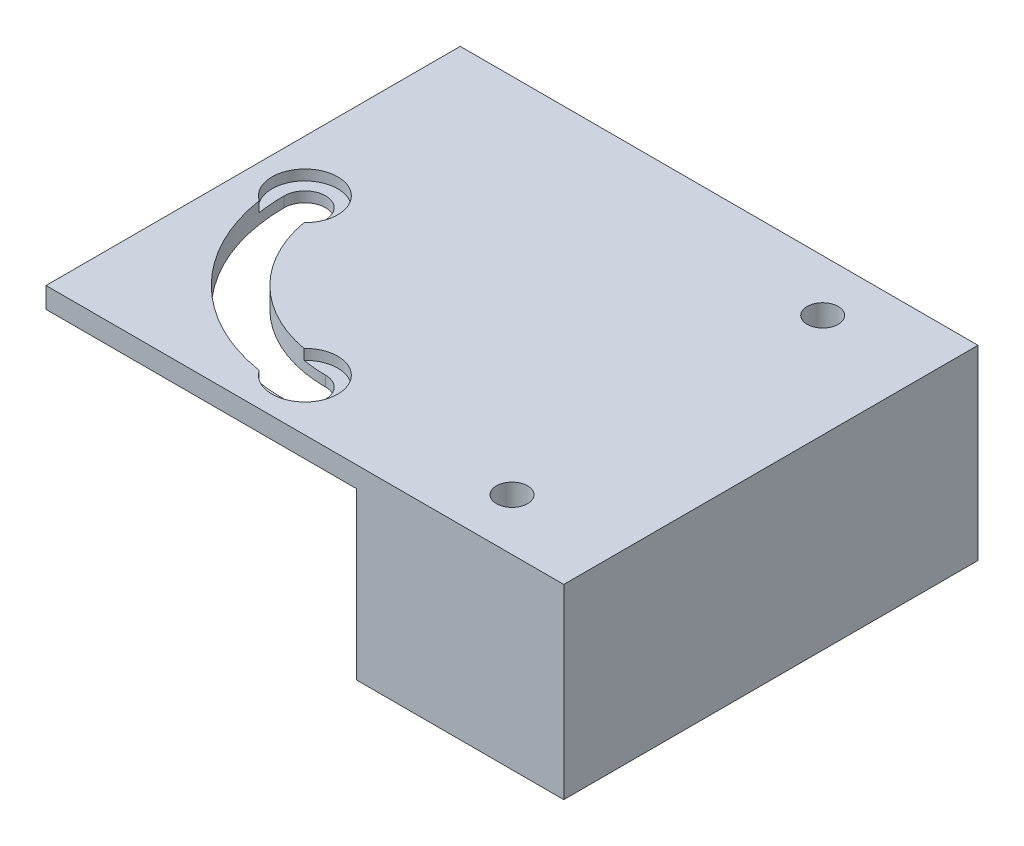
ISO-10303-21;
HEADER;
FILE_DESCRIPTION(('STEP AP214'),'2;1');
FILE_NAME('part.step','',(''),(''),'','','');
FILE_SCHEMA(('AUTOMOTIVE_DESIGN { 1 0 10303 214 1 1 1 1 }'));
ENDSEC;
DATA;
#1=APPLICATION_CONTEXT('core data for automotive mechanical design processes');
#2=APPLICATION_PROTOCOL_DEFINITION('international standard','automotive_design',2000,#1);
#3=PRODUCT_CONTEXT('',#1,'mechanical');
#4=PRODUCT('Part','Part','',(#3));
#5=PRODUCT_RELATED_PRODUCT_CATEGORY('part','',(#4));
#6=PRODUCT_DEFINITION_FORMATION('','',#4);
#7=PRODUCT_DEFINITION_CONTEXT('part definition',#1,'design');
#8=PRODUCT_DEFINITION('design','',#6,#7);
#9=PRODUCT_DEFINITION_SHAPE('','',#8);
#10=(LENGTH_UNIT() NAMED_UNIT(*) SI_UNIT(.MILLI.,.METRE.));
#11=(NAMED_UNIT(*) PLANE_ANGLE_UNIT() SI_UNIT($,.RADIAN.));
#12=(NAMED_UNIT(*) SI_UNIT($,.STERADIAN.) SOLID_ANGLE_UNIT());
#13=UNCERTAINTY_MEASURE_WITH_UNIT(LENGTH_MEASURE(1.E-05),#10,'distance_accuracy_value','');
#14=(GEOMETRIC_REPRESENTATION_CONTEXT(3) GLOBAL_UNCERTAINTY_ASSIGNED_CONTEXT((#13)) GLOBAL_UNIT_ASSIGNED_CONTEXT((#10,
#11,#12)) REPRESENTATION_CONTEXT('',''));
#15=CARTESIAN_POINT('',(0.,0.,0.));
#16=DIRECTION('',(0.,0.,1.));
#17=DIRECTION('',(1.,0.,0.));
#18=AXIS2_PLACEMENT_3D('',#15,#16,#17);
#19=CARTESIAN_POINT('',(-25.,-12.,0.));
#20=DIRECTION('',(0.,1.,0.));
#21=DIRECTION('',(0.,0.,1.));
#22=AXIS2_PLACEMENT_3D('',#19,#20,#21);
#23=CYLINDRICAL_SURFACE('',#22,2.);
#24=CARTESIAN_POINT('',(-25.,1.,0.));
#25=DIRECTION('',(0.,1.,0.));
#26=DIRECTION('',(0.,0.,1.));
#27=AXIS2_PLACEMENT_3D('',#24,#25,#26);
#28=CIRCLE('',#27,2.);
#29=CARTESIAN_POINT('',(-27.,1.,0.));
#30=VERTEX_POINT('',#29);
#31=CARTESIAN_POINT('',(-23.,1.,0.));
#32=VERTEX_POINT('',#31);
#33=EDGE_CURVE('E229',#30,#32,#28,.F.);
#34=ORIENTED_EDGE('',*,*,#33,.F.);
#35=DIRECTION('',(0.,1.,0.));
#36=VECTOR('',#35,1.);
#37=CARTESIAN_POINT('',(-27.,-12.,0.));
#38=LINE('',#37,#36);
#39=CARTESIAN_POINT('',(-27.,0.,0.));
#40=VERTEX_POINT('',#39);
#41=EDGE_CURVE('E159',#40,#30,#38,.T.);
#42=ORIENTED_EDGE('',*,*,#41,.F.);
#43=CARTESIAN_POINT('',(-25.,0.,0.));
#44=DIRECTION('',(0.,1.,0.));
#45=DIRECTION('',(0.,0.,1.));
#46=AXIS2_PLACEMENT_3D('',#43,#44,#45);
#47=CIRCLE('',#46,2.);
#48=CARTESIAN_POINT('',(-23.,0.,0.));
#49=VERTEX_POINT('',#48);
#50=EDGE_CURVE('E180',#49,#40,#47,.T.);
#51=ORIENTED_EDGE('',*,*,#50,.F.);
#52=DIRECTION('',(0.,1.,0.));
#53=VECTOR('',#52,1.);
#54=CARTESIAN_POINT('',(-23.,-12.,0.));
#55=LINE('',#54,#53);
#56=EDGE_CURVE('E166',#49,#32,#55,.T.);
#57=ORIENTED_EDGE('',*,*,#56,.T.);
#58=EDGE_LOOP('',(#34,#42,#51,#57));
#59=FACE_BOUND('',#58,.T.);
#60=ADVANCED_FACE('F32',(#59),#23,.F.);
#61=CARTESIAN_POINT('',(-10.,-12.,15.));
#62=DIRECTION('',(0.,1.,0.));
#63=DIRECTION('',(0.,0.,1.));
#64=AXIS2_PLACEMENT_3D('',#61,#62,#63);
#65=CYLINDRICAL_SURFACE('',#64,2.);
#66=CARTESIAN_POINT('',(-10.,1.,15.));
#67=DIRECTION('',(0.,1.,0.));
#68=DIRECTION('',(0.,0.,1.));
#69=AXIS2_PLACEMENT_3D('',#66,#67,#68);
#70=CIRCLE('',#69,2.);
#71=CARTESIAN_POINT('',(-10.,1.,13.));
#72=VERTEX_POINT('',#71);
#73=CARTESIAN_POINT('',(-10.,1.,17.));
#74=VERTEX_POINT('',#73);
#75=EDGE_CURVE('E239',#72,#74,#70,.F.);
#76=ORIENTED_EDGE('',*,*,#75,.F.);
#77=DIRECTION('',(0.,1.,0.));
#78=VECTOR('',#77,1.);
#79=CARTESIAN_POINT('',(-10.,-12.,13.));
#80=LINE('',#79,#78);
#81=CARTESIAN_POINT('',(-10.,0.,13.));
#82=VERTEX_POINT('',#81);
#83=EDGE_CURVE('E218',#82,#72,#80,.T.);
#84=ORIENTED_EDGE('',*,*,#83,.F.);
#85=CARTESIAN_POINT('',(-10.,0.,15.));
#86=DIRECTION('',(0.,1.,0.));
#87=DIRECTION('',(0.,0.,1.));
#88=AXIS2_PLACEMENT_3D('',#85,#86,#87);
#89=CIRCLE('',#88,2.);
#90=CARTESIAN_POINT('',(-10.,0.,17.));
#91=VERTEX_POINT('',#90);
#92=EDGE_CURVE('E174',#91,#82,#89,.T.);
#93=ORIENTED_EDGE('',*,*,#92,.F.);
#94=DIRECTION('',(0.,1.,0.));
#95=VECTOR('',#94,1.);
#96=CARTESIAN_POINT('',(-10.,-12.,17.));
#97=LINE('',#96,#95);
#98=EDGE_CURVE('E220',#91,#74,#97,.T.);
#99=ORIENTED_EDGE('',*,*,#98,.T.);
#100=EDGE_LOOP('',(#76,#84,#93,#99));
#101=FACE_BOUND('',#100,.T.);
#102=ADVANCED_FACE('F238',(#101),#65,.F.);
#103=CARTESIAN_POINT('',(0.,0.,0.));
#104=DIRECTION('',(0.,1.,0.));
#105=DIRECTION('',(0.,0.,1.));
#106=AXIS2_PLACEMENT_3D('',#103,#104,#105);
#107=PLANE('',#106);
#108=CARTESIAN_POINT('',(-10.,0.,0.));
#109=DIRECTION('',(0.,1.,0.));
#110=DIRECTION('',(0.,0.,1.));
#111=AXIS2_PLACEMENT_3D('',#108,#109,#110);
#112=CIRCLE('',#111,13.);
#113=EDGE_CURVE('E177',#82,#49,#112,.F.);
#114=ORIENTED_EDGE('',*,*,#113,.T.);
#115=ORIENTED_EDGE('',*,*,#50,.T.);
#116=CARTESIAN_POINT('',(-10.,0.,0.));
#117=DIRECTION('',(0.,1.,0.));
#118=DIRECTION('',(0.,0.,1.));
#119=AXIS2_PLACEMENT_3D('',#116,#117,#118);
#120=CIRCLE('',#119,17.);
#121=EDGE_CURVE('E171',#40,#91,#120,.T.);
#122=ORIENTED_EDGE('',*,*,#121,.T.);
#123=ORIENTED_EDGE('',*,*,#92,.T.);
#124=EDGE_LOOP('',(#114,#115,#122,#123));
#125=FACE_BOUND('',#124,.T.);
#126=CARTESIAN_POINT('',(-10.,0.,0.));
#127=DIRECTION('',(0.,1.,0.));
#128=DIRECTION('',(0.,0.,1.));
#129=AXIS2_PLACEMENT_3D('',#126,#127,#128);
#130=CIRCLE('',#129,3.5);
#131=CARTESIAN_POINT('',(-10.,0.,3.50000000000001));
#132=VERTEX_POINT('',#131);
#133=EDGE_CURVE('E183',#132,#132,#130,.F.);
#134=ORIENTED_EDGE('',*,*,#133,.F.);
#135=EDGE_LOOP('',(#134));
#136=FACE_BOUND('',#135,.T.);
#137=DIRECTION('',(0.,0.,-1.));
#138=VECTOR('',#137,1.);
#139=CARTESIAN_POINT('',(0.,0.,20.));
#140=LINE('',#139,#138);
#141=CARTESIAN_POINT('',(0.,0.,20.));
#142=VERTEX_POINT('',#141);
#143=CARTESIAN_POINT('',(0.,0.,-20.));
#144=VERTEX_POINT('',#143);
#145=EDGE_CURVE('E258',#142,#144,#140,.T.);
#146=ORIENTED_EDGE('',*,*,#145,.F.);
#147=DIRECTION('',(1.,0.,0.));
#148=VECTOR('',#147,1.);
#149=CARTESIAN_POINT('',(-30.,0.,20.));
#150=LINE('',#149,#148);
#151=CARTESIAN_POINT('',(-30.,0.,20.));
#152=VERTEX_POINT('',#151);
#153=EDGE_CURVE('E152',#152,#142,#150,.T.);
#154=ORIENTED_EDGE('',*,*,#153,.F.);
#155=DIRECTION('',(0.,0.,1.));
#156=VECTOR('',#155,1.);
#157=CARTESIAN_POINT('',(-30.,0.,-20.));
#158=LINE('',#157,#156);
#159=CARTESIAN_POINT('',(-30.,0.,-20.));
#160=VERTEX_POINT('',#159);
#161=EDGE_CURVE('E156',#160,#152,#158,.T.);
#162=ORIENTED_EDGE('',*,*,#161,.F.);
#163=DIRECTION('',(-1.,0.,0.));
#164=VECTOR('',#163,1.);
#165=CARTESIAN_POINT('',(-30.,0.,-20.));
#166=LINE('',#165,#164);
#167=EDGE_CURVE('E164',#144,#160,#166,.T.);
#168=ORIENTED_EDGE('',*,*,#167,.F.);
#169=EDGE_LOOP('',(#146,#154,#162,#168));
#170=FACE_BOUND('',#169,.T.);
#171=ADVANCED_FACE('F231',(#125,#136,#170),#107,.F.);
#172=CARTESIAN_POINT('',(-30.,2.,-20.));
#173=DIRECTION('',(0.,0.,1.));
#174=DIRECTION('',(1.,0.,0.));
#175=AXIS2_PLACEMENT_3D('',#172,#173,#174);
#176=PLANE('',#175);
#177=DIRECTION('',(-1.,0.,0.));
#178=VECTOR('',#177,1.);
#179=CARTESIAN_POINT('',(-30.,2.,-20.));
#180=LINE('',#179,#178);
#181=CARTESIAN_POINT('',(20.,2.,-20.));
#182=VERTEX_POINT('',#181);
#183=CARTESIAN_POINT('',(-30.,2.,-20.));
#184=VERTEX_POINT('',#183);
#185=EDGE_CURVE('E142',#182,#184,#180,.T.);
#186=ORIENTED_EDGE('',*,*,#185,.F.);
#187=DIRECTION('',(0.,1.,0.));
#188=VECTOR('',#187,1.);
#189=CARTESIAN_POINT('',(20.,-18.,-20.));
#190=LINE('',#189,#188);
#191=CARTESIAN_POINT('',(20.,-16.,-20.));
#192=VERTEX_POINT('',#191);
#193=EDGE_CURVE('E130',#192,#182,#190,.T.);
#194=ORIENTED_EDGE('',*,*,#193,.F.);
#195=DIRECTION('',(1.,0.,0.));
#196=VECTOR('',#195,1.);
#197=CARTESIAN_POINT('',(0.,-16.,-20.));
#198=LINE('',#197,#196);
#199=CARTESIAN_POINT('',(0.,-16.,-20.));
#200=VERTEX_POINT('',#199);
#201=EDGE_CURVE('E262',#200,#192,#198,.T.);
#202=ORIENTED_EDGE('',*,*,#201,.F.);
#203=DIRECTION('',(0.,1.,0.));
#204=VECTOR('',#203,1.);
#205=CARTESIAN_POINT('',(0.,-16.,-20.));
#206=LINE('',#205,#204);
#207=EDGE_CURVE('E212',#200,#144,#206,.T.);
#208=ORIENTED_EDGE('',*,*,#207,.T.);
#209=ORIENTED_EDGE('',*,*,#167,.T.);
#210=DIRECTION('',(0.,-1.,0.));
#211=VECTOR('',#210,1.);
#212=CARTESIAN_POINT('',(-30.,2.,-20.));
#213=LINE('',#212,#211);
#214=EDGE_CURVE('E149',#184,#160,#213,.T.);
#215=ORIENTED_EDGE('',*,*,#214,.F.);
#216=EDGE_LOOP('',(#186,#194,#202,#208,#209,#215));
#217=FACE_BOUND('',#216,.T.);
#218=ADVANCED_FACE('F34',(#217),#176,.F.);
#219=CARTESIAN_POINT('',(-30.,2.,-20.));
#220=DIRECTION('',(1.,0.,0.));
#221=DIRECTION('',(0.,0.,-1.));
#222=AXIS2_PLACEMENT_3D('',#219,#220,#221);
#223=PLANE('',#222);
#224=ORIENTED_EDGE('',*,*,#161,.T.);
#225=DIRECTION('',(0.,-1.,0.));
#226=VECTOR('',#225,1.);
#227=CARTESIAN_POINT('',(-30.,2.,20.));
#228=LINE('',#227,#226);
#229=CARTESIAN_POINT('',(-30.,2.,20.));
#230=VERTEX_POINT('',#229);
#231=EDGE_CURVE('E163',#230,#152,#228,.T.);
#232=ORIENTED_EDGE('',*,*,#231,.F.);
#233=DIRECTION('',(0.,0.,1.));
#234=VECTOR('',#233,1.);
#235=CARTESIAN_POINT('',(-30.,2.,-20.));
#236=LINE('',#235,#234);
#237=EDGE_CURVE('E151',#184,#230,#236,.T.);
#238=ORIENTED_EDGE('',*,*,#237,.F.);
#239=ORIENTED_EDGE('',*,*,#214,.T.);
#240=EDGE_LOOP('',(#224,#232,#238,#239));
#241=FACE_BOUND('',#240,.T.);
#242=ADVANCED_FACE('F281',(#241),#223,.F.);
#243=CARTESIAN_POINT('',(-30.,2.,20.));
#244=DIRECTION('',(0.,0.,-1.));
#245=DIRECTION('',(-1.,0.,0.));
#246=AXIS2_PLACEMENT_3D('',#243,#244,#245);
#247=PLANE('',#246);
#248=DIRECTION('',(-1.,0.,0.));
#249=VECTOR('',#248,1.);
#250=CARTESIAN_POINT('',(0.,-16.,20.));
#251=LINE('',#250,#249);
#252=CARTESIAN_POINT('',(20.,-16.,20.));
#253=VERTEX_POINT('',#252);
#254=CARTESIAN_POINT('',(0.,-16.,20.));
#255=VERTEX_POINT('',#254);
#256=EDGE_CURVE('E264',#253,#255,#251,.T.);
#257=ORIENTED_EDGE('',*,*,#256,.F.);
#258=DIRECTION('',(0.,1.,0.));
#259=VECTOR('',#258,1.);
#260=CARTESIAN_POINT('',(20.,-18.,20.));
#261=LINE('',#260,#259);
#262=CARTESIAN_POINT('',(20.,2.,20.));
#263=VERTEX_POINT('',#262);
#264=EDGE_CURVE('E46',#253,#263,#261,.T.);
#265=ORIENTED_EDGE('',*,*,#264,.T.);
#266=DIRECTION('',(1.,0.,0.));
#267=VECTOR('',#266,1.);
#268=CARTESIAN_POINT('',(-30.,2.,20.));
#269=LINE('',#268,#267);
#270=EDGE_CURVE('E145',#230,#263,#269,.T.);
#271=ORIENTED_EDGE('',*,*,#270,.F.);
#272=ORIENTED_EDGE('',*,*,#231,.T.);
#273=ORIENTED_EDGE('',*,*,#153,.T.);
#274=DIRECTION('',(0.,1.,0.));
#275=VECTOR('',#274,1.);
#276=CARTESIAN_POINT('',(0.,-16.,20.));
#277=LINE('',#276,#275);
#278=EDGE_CURVE('E266',#255,#142,#277,.T.);
#279=ORIENTED_EDGE('',*,*,#278,.F.);
#280=EDGE_LOOP('',(#257,#265,#271,#272,#273,#279));
#281=FACE_BOUND('',#280,.T.);
#282=ADVANCED_FACE('F284',(#281),#247,.F.);
#283=CARTESIAN_POINT('',(0.,2.,0.));
#284=DIRECTION('',(0.,1.,0.));
#285=DIRECTION('',(0.,0.,1.));
#286=AXIS2_PLACEMENT_3D('',#283,#284,#285);
#287=PLANE('',#286);
#288=CARTESIAN_POINT('',(10.,2.,-15.));
#289=DIRECTION('',(0.,1.,0.));
#290=DIRECTION('',(0.,0.,1.));
#291=AXIS2_PLACEMENT_3D('',#288,#289,#290);
#292=CIRCLE('',#291,1.49999999999999);
#293=CARTESIAN_POINT('',(10.,2.,-13.5));
#294=VERTEX_POINT('',#293);
#295=EDGE_CURVE('E425',#294,#294,#292,.T.);
#296=ORIENTED_EDGE('',*,*,#295,.F.);
#297=EDGE_LOOP('',(#296));
#298=FACE_BOUND('',#297,.T.);
#299=CARTESIAN_POINT('',(10.,2.,15.));
#300=DIRECTION('',(0.,1.,0.));
#301=DIRECTION('',(0.,0.,1.));
#302=AXIS2_PLACEMENT_3D('',#299,#300,#301);
#303=CIRCLE('',#302,1.49999999999999);
#304=CARTESIAN_POINT('',(10.,2.,16.5));
#305=VERTEX_POINT('',#304);
#306=EDGE_CURVE('E427',#305,#305,#303,.T.);
#307=ORIENTED_EDGE('',*,*,#306,.F.);
#308=EDGE_LOOP('',(#307));
#309=FACE_BOUND('',#308,.T.);
#310=DIRECTION('',(0.,0.,1.));
#311=VECTOR('',#310,1.);
#312=CARTESIAN_POINT('',(20.,2.,-20.));
#313=LINE('',#312,#311);
#314=EDGE_CURVE('E133',#182,#263,#313,.T.);
#315=ORIENTED_EDGE('',*,*,#314,.F.);
#316=ORIENTED_EDGE('',*,*,#185,.T.);
#317=ORIENTED_EDGE('',*,*,#237,.T.);
#318=ORIENTED_EDGE('',*,*,#270,.T.);
#319=EDGE_LOOP('',(#315,#316,#317,#318));
#320=FACE_BOUND('',#319,.T.);
#321=CARTESIAN_POINT('',(-25.,2.,0.));
#322=DIRECTION('',(0.,1.,0.));
#323=DIRECTION('',(0.,0.,1.));
#324=AXIS2_PLACEMENT_3D('',#321,#322,#323);
#325=CIRCLE('',#324,3.175);
#326=CARTESIAN_POINT('',(-22.7973125,2.,2.28665536916777));
#327=VERTEX_POINT('',#326);
#328=CARTESIAN_POINT('',(-26.7973125,2.,2.61730639729929));
#329=VERTEX_POINT('',#328);
#330=EDGE_CURVE('E204',#327,#329,#325,.T.);
#331=ORIENTED_EDGE('',*,*,#330,.F.);
#332=CARTESIAN_POINT('',(-10.,2.,0.));
#333=DIRECTION('',(0.,-1.,0.));
#334=DIRECTION('',(0.,0.,1.));
#335=AXIS2_PLACEMENT_3D('',#332,#333,#334);
#336=CIRCLE('',#335,13.);
#337=CARTESIAN_POINT('',(-12.2866553691678,2.,12.7973125));
#338=VERTEX_POINT('',#337);
#339=EDGE_CURVE('E207',#338,#327,#336,.T.);
#340=ORIENTED_EDGE('',*,*,#339,.F.);
#341=CARTESIAN_POINT('',(-10.,2.,15.));
#342=DIRECTION('',(0.,1.,0.));
#343=DIRECTION('',(0.,0.,1.));
#344=AXIS2_PLACEMENT_3D('',#341,#342,#343);
#345=CIRCLE('',#344,3.175);
#346=CARTESIAN_POINT('',(-12.6173063972993,2.,16.7973125));
#347=VERTEX_POINT('',#346);
#348=EDGE_CURVE('E206',#347,#338,#345,.T.);
#349=ORIENTED_EDGE('',*,*,#348,.F.);
#350=CARTESIAN_POINT('',(-10.,2.,0.));
#351=DIRECTION('',(0.,1.,0.));
#352=DIRECTION('',(0.,0.,1.));
#353=AXIS2_PLACEMENT_3D('',#350,#351,#352);
#354=CIRCLE('',#353,17.);
#355=EDGE_CURVE('E198',#329,#347,#354,.T.);
#356=ORIENTED_EDGE('',*,*,#355,.F.);
#357=EDGE_LOOP('',(#331,#340,#349,#356));
#358=FACE_BOUND('',#357,.T.);
#359=ADVANCED_FACE('F140',(#298,#309,#320,#358),#287,.T.);
#360=CARTESIAN_POINT('',(-10.,-12.,0.));
#361=DIRECTION('',(0.,1.,0.));
#362=DIRECTION('',(0.,0.,1.));
#363=AXIS2_PLACEMENT_3D('',#360,#361,#362);
#364=CYLINDRICAL_SURFACE('',#363,13.);
#365=ORIENTED_EDGE('',*,*,#339,.T.);
#366=DIRECTION('',(0.,1.,0.));
#367=VECTOR('',#366,1.);
#368=CARTESIAN_POINT('',(-22.7973125,1.5,2.28665536916777));
#369=LINE('',#368,#367);
#370=CARTESIAN_POINT('',(-22.7973125,1.,2.28665536916777));
#371=VERTEX_POINT('',#370);
#372=EDGE_CURVE('E255',#327,#371,#369,.F.);
#373=ORIENTED_EDGE('',*,*,#372,.T.);
#374=CARTESIAN_POINT('',(-10.,1.,0.));
#375=DIRECTION('',(0.,1.,0.));
#376=DIRECTION('',(0.,0.,1.));
#377=AXIS2_PLACEMENT_3D('',#374,#375,#376);
#378=CIRCLE('',#377,13.);
#379=EDGE_CURVE('E253',#32,#371,#378,.T.);
#380=ORIENTED_EDGE('',*,*,#379,.F.);
#381=ORIENTED_EDGE('',*,*,#56,.F.);
#382=ORIENTED_EDGE('',*,*,#113,.F.);
#383=ORIENTED_EDGE('',*,*,#83,.T.);
#384=CARTESIAN_POINT('',(-10.,1.,0.));
#385=DIRECTION('',(0.,1.,0.));
#386=DIRECTION('',(0.,0.,1.));
#387=AXIS2_PLACEMENT_3D('',#384,#385,#386);
#388=CIRCLE('',#387,13.);
#389=CARTESIAN_POINT('',(-12.2866553691678,1.,12.7973125));
#390=VERTEX_POINT('',#389);
#391=EDGE_CURVE('E242',#390,#72,#388,.T.);
#392=ORIENTED_EDGE('',*,*,#391,.F.);
#393=DIRECTION('',(0.,1.,0.));
#394=VECTOR('',#393,1.);
#395=CARTESIAN_POINT('',(-12.2866553691678,1.5,12.7973125));
#396=LINE('',#395,#394);
#397=EDGE_CURVE('E244',#390,#338,#396,.T.);
#398=ORIENTED_EDGE('',*,*,#397,.T.);
#399=EDGE_LOOP('',(#365,#373,#380,#381,#382,#383,#392,#398));
#400=FACE_BOUND('',#399,.T.);
#401=ADVANCED_FACE('F235',(#400),#364,.T.);
#402=CARTESIAN_POINT('',(-10.,-12.,0.));
#403=DIRECTION('',(0.,1.,0.));
#404=DIRECTION('',(0.,0.,1.));
#405=AXIS2_PLACEMENT_3D('',#402,#403,#404);
#406=CYLINDRICAL_SURFACE('',#405,17.);
#407=CARTESIAN_POINT('',(-10.,1.,0.));
#408=DIRECTION('',(0.,1.,0.));
#409=DIRECTION('',(0.,0.,1.));
#410=AXIS2_PLACEMENT_3D('',#407,#408,#409);
#411=CIRCLE('',#410,17.);
#412=CARTESIAN_POINT('',(-26.7973125,1.,2.61730639729929));
#413=VERTEX_POINT('',#412);
#414=EDGE_CURVE('E191',#413,#30,#411,.F.);
#415=ORIENTED_EDGE('',*,*,#414,.F.);
#416=DIRECTION('',(0.,1.,0.));
#417=VECTOR('',#416,1.);
#418=CARTESIAN_POINT('',(-26.7973125,1.5,2.61730639729929));
#419=LINE('',#418,#417);
#420=EDGE_CURVE('E40',#413,#329,#419,.T.);
#421=ORIENTED_EDGE('',*,*,#420,.T.);
#422=ORIENTED_EDGE('',*,*,#355,.T.);
#423=DIRECTION('',(0.,1.,0.));
#424=VECTOR('',#423,1.);
#425=CARTESIAN_POINT('',(-12.6173063972993,1.5,16.7973125));
#426=LINE('',#425,#424);
#427=CARTESIAN_POINT('',(-12.6173063972993,1.,16.7973125));
#428=VERTEX_POINT('',#427);
#429=EDGE_CURVE('E188',#347,#428,#426,.F.);
#430=ORIENTED_EDGE('',*,*,#429,.T.);
#431=CARTESIAN_POINT('',(-10.,1.,0.));
#432=DIRECTION('',(0.,1.,0.));
#433=DIRECTION('',(0.,0.,1.));
#434=AXIS2_PLACEMENT_3D('',#431,#432,#433);
#435=CIRCLE('',#434,17.);
#436=EDGE_CURVE('E186',#74,#428,#435,.F.);
#437=ORIENTED_EDGE('',*,*,#436,.F.);
#438=ORIENTED_EDGE('',*,*,#98,.F.);
#439=ORIENTED_EDGE('',*,*,#121,.F.);
#440=ORIENTED_EDGE('',*,*,#41,.T.);
#441=EDGE_LOOP('',(#415,#421,#422,#430,#437,#438,#439,#440));
#442=FACE_BOUND('',#441,.T.);
#443=ADVANCED_FACE('F197',(#442),#406,.F.);
#444=CARTESIAN_POINT('',(-10.,-16.,0.));
#445=DIRECTION('',(0.,1.,0.));
#446=DIRECTION('',(0.,0.,1.));
#447=AXIS2_PLACEMENT_3D('',#444,#445,#446);
#448=CYLINDRICAL_SURFACE('',#447,3.5);
#449=CARTESIAN_POINT('',(-10.,-16.,0.));
#450=DIRECTION('',(0.,-1.,0.));
#451=DIRECTION('',(0.,0.,-1.));
#452=AXIS2_PLACEMENT_3D('',#449,#450,#451);
#453=CIRCLE('',#452,3.5);
#454=CARTESIAN_POINT('',(-10.,-16.,-3.49999999999999));
#455=VERTEX_POINT('',#454);
#456=EDGE_CURVE('E208',#455,#455,#453,.T.);
#457=ORIENTED_EDGE('',*,*,#456,.F.);
#458=EDGE_LOOP('',(#457));
#459=FACE_BOUND('',#458,.T.);
#460=ORIENTED_EDGE('',*,*,#133,.T.);
#461=EDGE_LOOP('',(#460));
#462=FACE_BOUND('',#461,.T.);
#463=ADVANCED_FACE('F357',(#459,#462),#448,.T.);
#464=CARTESIAN_POINT('',(-10.,-16.,0.));
#465=DIRECTION('',(0.,-1.,0.));
#466=DIRECTION('',(0.,0.,-1.));
#467=AXIS2_PLACEMENT_3D('',#464,#465,#466);
#468=PLANE('',#467);
#469=ORIENTED_EDGE('',*,*,#456,.T.);
#470=EDGE_LOOP('',(#469));
#471=FACE_BOUND('',#470,.T.);
#472=ADVANCED_FACE('F462',(#471),#468,.T.);
#473=CARTESIAN_POINT('',(0.,-16.,20.));
#474=DIRECTION('',(1.,0.,0.));
#475=DIRECTION('',(0.,0.,-1.));
#476=AXIS2_PLACEMENT_3D('',#473,#474,#475);
#477=PLANE('',#476);
#478=ORIENTED_EDGE('',*,*,#145,.T.);
#479=ORIENTED_EDGE('',*,*,#207,.F.);
#480=DIRECTION('',(0.,0.,-1.));
#481=VECTOR('',#480,1.);
#482=CARTESIAN_POINT('',(0.,-16.,20.));
#483=LINE('',#482,#481);
#484=EDGE_CURVE('E259',#255,#200,#483,.T.);
#485=ORIENTED_EDGE('',*,*,#484,.F.);
#486=ORIENTED_EDGE('',*,*,#278,.T.);
#487=EDGE_LOOP('',(#478,#479,#485,#486));
#488=FACE_BOUND('',#487,.T.);
#489=ADVANCED_FACE('F274',(#488),#477,.F.);
#490=CARTESIAN_POINT('',(0.,-16.,0.));
#491=DIRECTION('',(0.,-1.,0.));
#492=DIRECTION('',(0.,0.,-1.));
#493=AXIS2_PLACEMENT_3D('',#490,#491,#492);
#494=PLANE('',#493);
#495=CARTESIAN_POINT('',(10.,-16.,-15.));
#496=DIRECTION('',(0.,1.,0.));
#497=DIRECTION('',(0.,0.,1.));
#498=AXIS2_PLACEMENT_3D('',#495,#496,#497);
#499=CIRCLE('',#498,1.5);
#500=CARTESIAN_POINT('',(10.,-16.,-13.5));
#501=VERTEX_POINT('',#500);
#502=EDGE_CURVE('E422',#501,#501,#499,.T.);
#503=ORIENTED_EDGE('',*,*,#502,.T.);
#504=EDGE_LOOP('',(#503));
#505=FACE_BOUND('',#504,.T.);
#506=CARTESIAN_POINT('',(10.,-16.,15.));
#507=DIRECTION('',(0.,1.,0.));
#508=DIRECTION('',(0.,0.,1.));
#509=AXIS2_PLACEMENT_3D('',#506,#507,#508);
#510=CIRCLE('',#509,1.5);
#511=CARTESIAN_POINT('',(10.,-16.,16.5));
#512=VERTEX_POINT('',#511);
#513=EDGE_CURVE('E146',#512,#512,#510,.T.);
#514=ORIENTED_EDGE('',*,*,#513,.T.);
#515=EDGE_LOOP('',(#514));
#516=FACE_BOUND('',#515,.T.);
#517=DIRECTION('',(0.,0.,-1.));
#518=VECTOR('',#517,1.);
#519=CARTESIAN_POINT('',(20.,-16.,0.));
#520=LINE('',#519,#518);
#521=EDGE_CURVE('E11',#253,#192,#520,.T.);
#522=ORIENTED_EDGE('',*,*,#521,.F.);
#523=ORIENTED_EDGE('',*,*,#256,.T.);
#524=ORIENTED_EDGE('',*,*,#484,.T.);
#525=ORIENTED_EDGE('',*,*,#201,.T.);
#526=EDGE_LOOP('',(#522,#523,#524,#525));
#527=FACE_BOUND('',#526,.T.);
#528=ADVANCED_FACE('F295',(#505,#516,#527),#494,.T.);
#529=CARTESIAN_POINT('',(-10.,1.,15.));
#530=DIRECTION('',(0.,1.,0.));
#531=DIRECTION('',(0.,0.,1.));
#532=AXIS2_PLACEMENT_3D('',#529,#530,#531);
#533=CYLINDRICAL_SURFACE('',#532,3.175);
#534=CARTESIAN_POINT('',(-10.,1.,15.));
#535=DIRECTION('',(0.,1.,0.));
#536=DIRECTION('',(0.,0.,1.));
#537=AXIS2_PLACEMENT_3D('',#534,#535,#536);
#538=CIRCLE('',#537,3.175);
#539=EDGE_CURVE('E286',#428,#390,#538,.T.);
#540=ORIENTED_EDGE('',*,*,#539,.F.);
#541=ORIENTED_EDGE('',*,*,#429,.F.);
#542=ORIENTED_EDGE('',*,*,#348,.T.);
#543=ORIENTED_EDGE('',*,*,#397,.F.);
#544=EDGE_LOOP('',(#540,#541,#542,#543));
#545=FACE_BOUND('',#544,.T.);
#546=ADVANCED_FACE('F293',(#545),#533,.F.);
#547=CARTESIAN_POINT('',(-10.,1.,15.));
#548=DIRECTION('',(0.,1.,0.));
#549=DIRECTION('',(0.,0.,1.));
#550=AXIS2_PLACEMENT_3D('',#547,#548,#549);
#551=PLANE('',#550);
#552=ORIENTED_EDGE('',*,*,#391,.T.);
#553=ORIENTED_EDGE('',*,*,#75,.T.);
#554=ORIENTED_EDGE('',*,*,#436,.T.);
#555=ORIENTED_EDGE('',*,*,#539,.T.);
#556=EDGE_LOOP('',(#552,#553,#554,#555));
#557=FACE_BOUND('',#556,.T.);
#558=ADVANCED_FACE('F291',(#557),#551,.T.);
#559=CARTESIAN_POINT('',(-25.,1.,0.));
#560=DIRECTION('',(0.,1.,0.));
#561=DIRECTION('',(0.,0.,1.));
#562=AXIS2_PLACEMENT_3D('',#559,#560,#561);
#563=CYLINDRICAL_SURFACE('',#562,3.175);
#564=ORIENTED_EDGE('',*,*,#330,.T.);
#565=ORIENTED_EDGE('',*,*,#420,.F.);
#566=CARTESIAN_POINT('',(-25.,1.,0.));
#567=DIRECTION('',(0.,1.,0.));
#568=DIRECTION('',(0.,0.,1.));
#569=AXIS2_PLACEMENT_3D('',#566,#567,#568);
#570=CIRCLE('',#569,3.175);
#571=EDGE_CURVE('E54',#371,#413,#570,.T.);
#572=ORIENTED_EDGE('',*,*,#571,.F.);
#573=ORIENTED_EDGE('',*,*,#372,.F.);
#574=EDGE_LOOP('',(#564,#565,#572,#573));
#575=FACE_BOUND('',#574,.T.);
#576=ADVANCED_FACE('F301',(#575),#563,.F.);
#577=CARTESIAN_POINT('',(-25.,1.,0.));
#578=DIRECTION('',(0.,1.,0.));
#579=DIRECTION('',(0.,0.,1.));
#580=AXIS2_PLACEMENT_3D('',#577,#578,#579);
#581=PLANE('',#580);
#582=ORIENTED_EDGE('',*,*,#379,.T.);
#583=ORIENTED_EDGE('',*,*,#571,.T.);
#584=ORIENTED_EDGE('',*,*,#414,.T.);
#585=ORIENTED_EDGE('',*,*,#33,.T.);
#586=EDGE_LOOP('',(#582,#583,#584,#585));
#587=FACE_BOUND('',#586,.T.);
#588=ADVANCED_FACE('F377',(#587),#581,.T.);
#589=CARTESIAN_POINT('',(20.,-18.,-20.));
#590=DIRECTION('',(-1.,0.,0.));
#591=DIRECTION('',(0.,0.,1.));
#592=AXIS2_PLACEMENT_3D('',#589,#590,#591);
#593=PLANE('',#592);
#594=ORIENTED_EDGE('',*,*,#521,.T.);
#595=ORIENTED_EDGE('',*,*,#193,.T.);
#596=ORIENTED_EDGE('',*,*,#314,.T.);
#597=ORIENTED_EDGE('',*,*,#264,.F.);
#598=EDGE_LOOP('',(#594,#595,#596,#597));
#599=FACE_BOUND('',#598,.T.);
#600=ADVANCED_FACE('F132',(#599),#593,.F.);
#601=CARTESIAN_POINT('',(10.,2.,15.));
#602=DIRECTION('',(0.,1.,0.));
#603=DIRECTION('',(0.,0.,1.));
#604=AXIS2_PLACEMENT_3D('',#601,#602,#603);
#605=CYLINDRICAL_SURFACE('',#604,1.49999999999999);
#606=ORIENTED_EDGE('',*,*,#513,.F.);
#607=EDGE_LOOP('',(#606));
#608=FACE_BOUND('',#607,.T.);
#609=ORIENTED_EDGE('',*,*,#306,.T.);
#610=EDGE_LOOP('',(#609));
#611=FACE_BOUND('',#610,.T.);
#612=ADVANCED_FACE('F394',(#608,#611),#605,.F.);
#613=CARTESIAN_POINT('',(10.,2.,-15.));
#614=DIRECTION('',(0.,1.,0.));
#615=DIRECTION('',(0.,0.,1.));
#616=AXIS2_PLACEMENT_3D('',#613,#614,#615);
#617=CYLINDRICAL_SURFACE('',#616,1.49999999999999);
#618=ORIENTED_EDGE('',*,*,#502,.F.);
#619=EDGE_LOOP('',(#618));
#620=FACE_BOUND('',#619,.T.);
#621=ORIENTED_EDGE('',*,*,#295,.T.);
#622=EDGE_LOOP('',(#621));
#623=FACE_BOUND('',#622,.T.);
#624=ADVANCED_FACE('F401',(#620,#623),#617,.F.);
#625=CLOSED_SHELL('',(#60,#102,#171,#218,#242,#282,#359,#401,#443,#463,#472,#489,#528,#546,#558,
#576,#588,#600,#612,#624));
#626=MANIFOLD_SOLID_BREP('B2',#625);
#627=ADVANCED_BREP_SHAPE_REPRESENTATION('',(#18,#626),#14);
#628=SHAPE_DEFINITION_REPRESENTATION(#9,#627);
ENDSEC;
END-ISO-10303-21;
